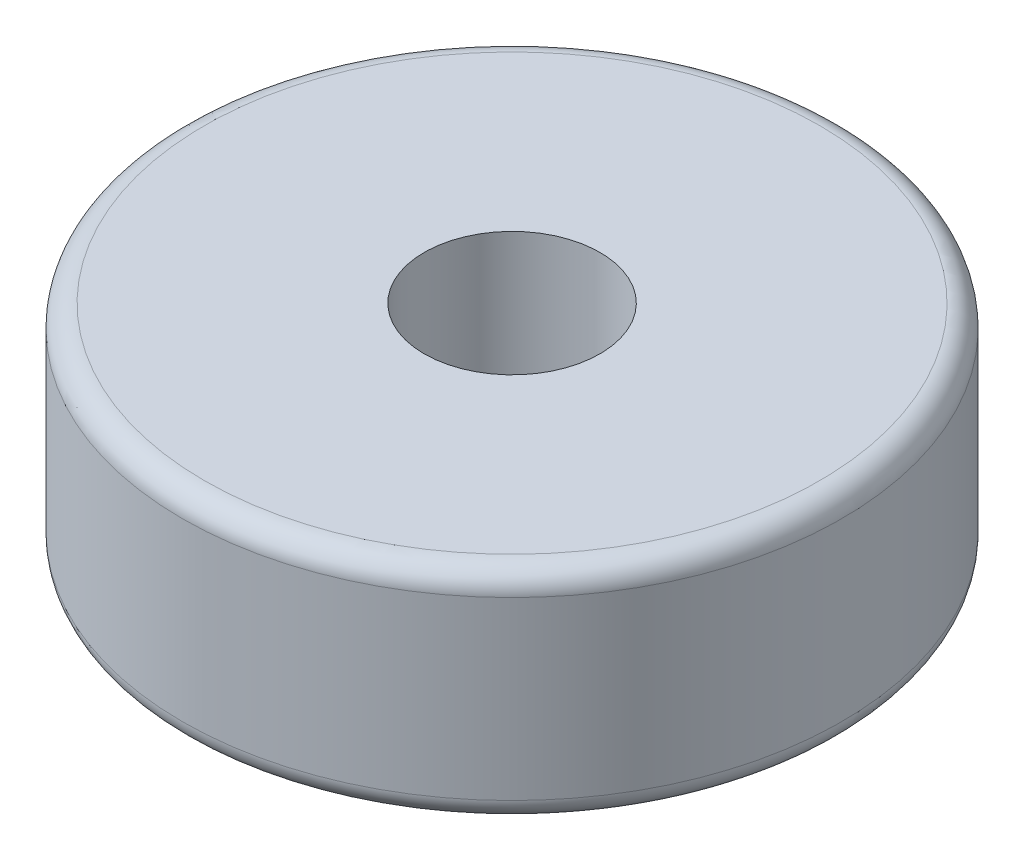
ISO-10303-21;
HEADER;
FILE_DESCRIPTION(('STEP AP214'),'2;1');
FILE_NAME('part.step','',(''),(''),'','','');
FILE_SCHEMA(('AUTOMOTIVE_DESIGN { 1 0 10303 214 1 1 1 1 }'));
ENDSEC;
DATA;
#1=APPLICATION_CONTEXT('core data for automotive mechanical design processes');
#2=APPLICATION_PROTOCOL_DEFINITION('international standard','automotive_design',2000,#1);
#3=PRODUCT_CONTEXT('',#1,'mechanical');
#4=PRODUCT('Part','Part','',(#3));
#5=PRODUCT_RELATED_PRODUCT_CATEGORY('part','',(#4));
#6=PRODUCT_DEFINITION_FORMATION('','',#4);
#7=PRODUCT_DEFINITION_CONTEXT('part definition',#1,'design');
#8=PRODUCT_DEFINITION('design','',#6,#7);
#9=PRODUCT_DEFINITION_SHAPE('','',#8);
#10=(LENGTH_UNIT() NAMED_UNIT(*) SI_UNIT(.MILLI.,.METRE.));
#11=(NAMED_UNIT(*) PLANE_ANGLE_UNIT() SI_UNIT($,.RADIAN.));
#12=(NAMED_UNIT(*) SI_UNIT($,.STERADIAN.) SOLID_ANGLE_UNIT());
#13=UNCERTAINTY_MEASURE_WITH_UNIT(LENGTH_MEASURE(1.E-05),#10,'distance_accuracy_value','');
#14=(GEOMETRIC_REPRESENTATION_CONTEXT(3) GLOBAL_UNCERTAINTY_ASSIGNED_CONTEXT((#13)) GLOBAL_UNIT_ASSIGNED_CONTEXT((#10,
#11,#12)) REPRESENTATION_CONTEXT('',''));
#15=CARTESIAN_POINT('',(0.,0.,0.));
#16=DIRECTION('',(0.,0.,1.));
#17=DIRECTION('',(1.,0.,0.));
#18=AXIS2_PLACEMENT_3D('',#15,#16,#17);
#19=CARTESIAN_POINT('',(0.,25.4,0.));
#20=DIRECTION('',(0.,1.,0.));
#21=DIRECTION('',(0.,0.,1.));
#22=AXIS2_PLACEMENT_3D('',#19,#20,#21);
#23=PLANE('',#22);
#24=CARTESIAN_POINT('',(0.,25.4,0.));
#25=DIRECTION('',(0.,1.,0.));
#26=DIRECTION('',(0.,0.,1.));
#27=AXIS2_PLACEMENT_3D('',#24,#25,#26);
#28=CIRCLE('',#27,35.56);
#29=CARTESIAN_POINT('',(0.,25.4,35.56));
#30=VERTEX_POINT('',#29);
#31=EDGE_CURVE('E56',#30,#30,#28,.T.);
#32=ORIENTED_EDGE('',*,*,#31,.T.);
#33=EDGE_LOOP('',(#32));
#34=FACE_BOUND('',#33,.T.);
#35=CARTESIAN_POINT('',(0.,25.4,0.));
#36=DIRECTION('',(0.,1.,0.));
#37=DIRECTION('',(0.,0.,1.));
#38=AXIS2_PLACEMENT_3D('',#35,#36,#37);
#39=CIRCLE('',#38,10.16);
#40=CARTESIAN_POINT('',(0.,25.4,10.16));
#41=VERTEX_POINT('',#40);
#42=EDGE_CURVE('E61',#41,#41,#39,.T.);
#43=ORIENTED_EDGE('',*,*,#42,.F.);
#44=EDGE_LOOP('',(#43));
#45=FACE_BOUND('',#44,.T.);
#46=ADVANCED_FACE('F37',(#34,#45),#23,.T.);
#47=CARTESIAN_POINT('',(0.,0.,0.));
#48=DIRECTION('',(0.,1.,0.));
#49=DIRECTION('',(0.,0.,1.));
#50=AXIS2_PLACEMENT_3D('',#47,#48,#49);
#51=PLANE('',#50);
#52=CARTESIAN_POINT('',(0.,0.,0.));
#53=DIRECTION('',(0.,1.,0.));
#54=DIRECTION('',(0.,0.,1.));
#55=AXIS2_PLACEMENT_3D('',#52,#53,#54);
#56=CIRCLE('',#55,35.56);
#57=CARTESIAN_POINT('',(0.,0.,35.56));
#58=VERTEX_POINT('',#57);
#59=EDGE_CURVE('E10',#58,#58,#56,.F.);
#60=ORIENTED_EDGE('',*,*,#59,.T.);
#61=EDGE_LOOP('',(#60));
#62=FACE_BOUND('',#61,.T.);
#63=CARTESIAN_POINT('',(0.,0.,0.));
#64=DIRECTION('',(0.,1.,0.));
#65=DIRECTION('',(0.,0.,1.));
#66=AXIS2_PLACEMENT_3D('',#63,#64,#65);
#67=CIRCLE('',#66,10.16);
#68=CARTESIAN_POINT('',(0.,0.,10.16));
#69=VERTEX_POINT('',#68);
#70=EDGE_CURVE('E62',#69,#69,#67,.T.);
#71=ORIENTED_EDGE('',*,*,#70,.T.);
#72=EDGE_LOOP('',(#71));
#73=FACE_BOUND('',#72,.T.);
#74=ADVANCED_FACE('F74',(#62,#73),#51,.F.);
#75=CARTESIAN_POINT('',(0.,25.4,0.));
#76=DIRECTION('',(0.,-1.,0.));
#77=DIRECTION('',(0.,0.,-1.));
#78=AXIS2_PLACEMENT_3D('',#75,#76,#77);
#79=CYLINDRICAL_SURFACE('',#78,38.1);
#80=CARTESIAN_POINT('',(0.,22.86,0.));
#81=DIRECTION('',(0.,1.,0.));
#82=DIRECTION('',(0.,0.,1.));
#83=AXIS2_PLACEMENT_3D('',#80,#81,#82);
#84=CIRCLE('',#83,38.1);
#85=CARTESIAN_POINT('',(0.,22.86,38.1));
#86=VERTEX_POINT('',#85);
#87=EDGE_CURVE('E45',#86,#86,#84,.F.);
#88=ORIENTED_EDGE('',*,*,#87,.T.);
#89=EDGE_LOOP('',(#88));
#90=FACE_BOUND('',#89,.T.);
#91=CARTESIAN_POINT('',(0.,2.54,0.));
#92=DIRECTION('',(0.,1.,0.));
#93=DIRECTION('',(0.,0.,1.));
#94=AXIS2_PLACEMENT_3D('',#91,#92,#93);
#95=CIRCLE('',#94,38.1);
#96=CARTESIAN_POINT('',(0.,2.54,38.1));
#97=VERTEX_POINT('',#96);
#98=EDGE_CURVE('E52',#97,#97,#95,.T.);
#99=ORIENTED_EDGE('',*,*,#98,.T.);
#100=EDGE_LOOP('',(#99));
#101=FACE_BOUND('',#100,.T.);
#102=ADVANCED_FACE('F80',(#90,#101),#79,.T.);
#103=CARTESIAN_POINT('',(0.,25.4,0.));
#104=DIRECTION('',(0.,-1.,0.));
#105=DIRECTION('',(0.,0.,-1.));
#106=AXIS2_PLACEMENT_3D('',#103,#104,#105);
#107=CYLINDRICAL_SURFACE('',#106,10.16);
#108=ORIENTED_EDGE('',*,*,#42,.T.);
#109=EDGE_LOOP('',(#108));
#110=FACE_BOUND('',#109,.T.);
#111=ORIENTED_EDGE('',*,*,#70,.F.);
#112=EDGE_LOOP('',(#111));
#113=FACE_BOUND('',#112,.T.);
#114=ADVANCED_FACE('F70',(#110,#113),#107,.F.);
#115=CARTESIAN_POINT('',(0.,22.86,0.));
#116=DIRECTION('',(0.,1.,0.));
#117=DIRECTION('',(0.,0.,1.));
#118=AXIS2_PLACEMENT_3D('',#115,#116,#117);
#119=TOROIDAL_SURFACE('',#118,35.56,2.54);
#120=ORIENTED_EDGE('',*,*,#87,.F.);
#121=EDGE_LOOP('',(#120));
#122=FACE_BOUND('',#121,.T.);
#123=ORIENTED_EDGE('',*,*,#31,.F.);
#124=EDGE_LOOP('',(#123));
#125=FACE_BOUND('',#124,.T.);
#126=ADVANCED_FACE('F85',(#122,#125),#119,.T.);
#127=CARTESIAN_POINT('',(0.,2.54,0.));
#128=DIRECTION('',(0.,1.,0.));
#129=DIRECTION('',(0.,0.,1.));
#130=AXIS2_PLACEMENT_3D('',#127,#128,#129);
#131=TOROIDAL_SURFACE('',#130,35.56,2.54);
#132=ORIENTED_EDGE('',*,*,#59,.F.);
#133=EDGE_LOOP('',(#132));
#134=FACE_BOUND('',#133,.T.);
#135=ORIENTED_EDGE('',*,*,#98,.F.);
#136=EDGE_LOOP('',(#135));
#137=FACE_BOUND('',#136,.T.);
#138=ADVANCED_FACE('F39',(#134,#137),#131,.T.);
#139=CLOSED_SHELL('',(#46,#74,#102,#114,#126,#138));
#140=MANIFOLD_SOLID_BREP('B2',#139);
#141=ADVANCED_BREP_SHAPE_REPRESENTATION('',(#18,#140),#14);
#142=SHAPE_DEFINITION_REPRESENTATION(#9,#141);
ENDSEC;
END-ISO-10303-21;
